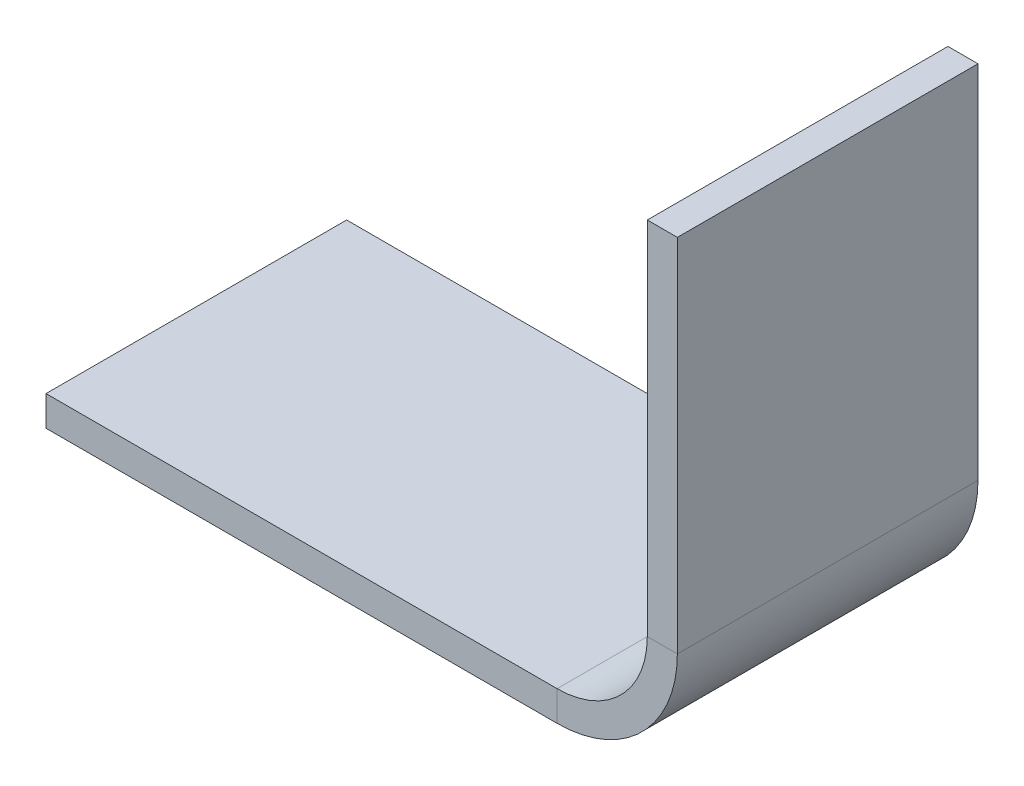
ISO-10303-21;
HEADER;
FILE_DESCRIPTION(('STEP AP214'),'2;1');
FILE_NAME('part.step','',(''),(''),'','','');
FILE_SCHEMA(('AUTOMOTIVE_DESIGN { 1 0 10303 214 1 1 1 1 }'));
ENDSEC;
DATA;
#1=APPLICATION_CONTEXT('core data for automotive mechanical design processes');
#2=APPLICATION_PROTOCOL_DEFINITION('international standard','automotive_design',2000,#1);
#3=PRODUCT_CONTEXT('',#1,'mechanical');
#4=PRODUCT('Part','Part','',(#3));
#5=PRODUCT_RELATED_PRODUCT_CATEGORY('part','',(#4));
#6=PRODUCT_DEFINITION_FORMATION('','',#4);
#7=PRODUCT_DEFINITION_CONTEXT('part definition',#1,'design');
#8=PRODUCT_DEFINITION('design','',#6,#7);
#9=PRODUCT_DEFINITION_SHAPE('','',#8);
#10=(LENGTH_UNIT() NAMED_UNIT(*) SI_UNIT(.MILLI.,.METRE.));
#11=(NAMED_UNIT(*) PLANE_ANGLE_UNIT() SI_UNIT($,.RADIAN.));
#12=(NAMED_UNIT(*) SI_UNIT($,.STERADIAN.) SOLID_ANGLE_UNIT());
#13=UNCERTAINTY_MEASURE_WITH_UNIT(LENGTH_MEASURE(1.E-05),#10,'distance_accuracy_value','');
#14=(GEOMETRIC_REPRESENTATION_CONTEXT(3) GLOBAL_UNCERTAINTY_ASSIGNED_CONTEXT((#13)) GLOBAL_UNIT_ASSIGNED_CONTEXT((#10,
#11,#12)) REPRESENTATION_CONTEXT('',''));
#15=CARTESIAN_POINT('',(0.,0.,0.));
#16=DIRECTION('',(0.,0.,1.));
#17=DIRECTION('',(1.,0.,0.));
#18=AXIS2_PLACEMENT_3D('',#15,#16,#17);
#19=CARTESIAN_POINT('',(20.,3.,10.));
#20=DIRECTION('',(0.,0.,1.));
#21=DIRECTION('',(1.,0.,0.));
#22=AXIS2_PLACEMENT_3D('',#19,#20,#21);
#23=PLANE('',#22);
#24=DIRECTION('',(1.,0.,0.));
#25=VECTOR('',#24,1.);
#26=CARTESIAN_POINT('',(20.,3.,10.));
#27=LINE('',#26,#25);
#28=CARTESIAN_POINT('',(20.,3.,10.));
#29=VERTEX_POINT('',#28);
#30=CARTESIAN_POINT('',(21.,3.,10.));
#31=VERTEX_POINT('',#30);
#32=EDGE_CURVE('E11',#29,#31,#27,.T.);
#33=ORIENTED_EDGE('',*,*,#32,.F.);
#34=CARTESIAN_POINT('',(17.,3.,10.));
#35=DIRECTION('',(0.,0.,-1.));
#36=DIRECTION('',(-1.,0.,0.));
#37=AXIS2_PLACEMENT_3D('',#34,#35,#36);
#38=CIRCLE('',#37,3.);
#39=CARTESIAN_POINT('',(17.,0.,10.));
#40=VERTEX_POINT('',#39);
#41=EDGE_CURVE('E139',#40,#29,#38,.F.);
#42=ORIENTED_EDGE('',*,*,#41,.F.);
#43=DIRECTION('',(0.,1.,0.));
#44=VECTOR('',#43,1.);
#45=CARTESIAN_POINT('',(17.,-1.,10.));
#46=LINE('',#45,#44);
#47=CARTESIAN_POINT('',(17.,-1.,10.));
#48=VERTEX_POINT('',#47);
#49=EDGE_CURVE('E47',#48,#40,#46,.T.);
#50=ORIENTED_EDGE('',*,*,#49,.F.);
#51=CARTESIAN_POINT('',(17.,3.,10.));
#52=DIRECTION('',(0.,0.,1.));
#53=DIRECTION('',(1.,0.,0.));
#54=AXIS2_PLACEMENT_3D('',#51,#52,#53);
#55=CIRCLE('',#54,4.);
#56=EDGE_CURVE('E133',#48,#31,#55,.T.);
#57=ORIENTED_EDGE('',*,*,#56,.T.);
#58=EDGE_LOOP('',(#33,#42,#50,#57));
#59=FACE_BOUND('',#58,.T.);
#60=ADVANCED_FACE('F41',(#59),#23,.T.);
#61=CARTESIAN_POINT('',(17.,-1.,10.));
#62=DIRECTION('',(0.,0.,1.));
#63=DIRECTION('',(1.,0.,0.));
#64=AXIS2_PLACEMENT_3D('',#61,#62,#63);
#65=PLANE('',#64);
#66=DIRECTION('',(0.,1.,0.));
#67=VECTOR('',#66,1.);
#68=CARTESIAN_POINT('',(20.,0.,10.));
#69=LINE('',#68,#67);
#70=CARTESIAN_POINT('',(20.,15.,10.));
#71=VERTEX_POINT('',#70);
#72=EDGE_CURVE('E189',#29,#71,#69,.T.);
#73=ORIENTED_EDGE('',*,*,#72,.F.);
#74=ORIENTED_EDGE('',*,*,#32,.T.);
#75=DIRECTION('',(0.,1.,0.));
#76=VECTOR('',#75,1.);
#77=CARTESIAN_POINT('',(21.,0.,10.));
#78=LINE('',#77,#76);
#79=CARTESIAN_POINT('',(21.,15.,10.));
#80=VERTEX_POINT('',#79);
#81=EDGE_CURVE('E100',#31,#80,#78,.T.);
#82=ORIENTED_EDGE('',*,*,#81,.T.);
#83=DIRECTION('',(1.,0.,0.));
#84=VECTOR('',#83,1.);
#85=CARTESIAN_POINT('',(20.,15.,10.));
#86=LINE('',#85,#84);
#87=EDGE_CURVE('E341',#71,#80,#86,.T.);
#88=ORIENTED_EDGE('',*,*,#87,.F.);
#89=EDGE_LOOP('',(#73,#74,#82,#88));
#90=FACE_BOUND('',#89,.T.);
#91=ADVANCED_FACE('F193',(#90),#65,.T.);
#92=CARTESIAN_POINT('',(17.,0.,0.));
#93=DIRECTION('',(0.,0.,-1.));
#94=DIRECTION('',(-1.,0.,0.));
#95=AXIS2_PLACEMENT_3D('',#92,#93,#94);
#96=PLANE('',#95);
#97=DIRECTION('',(0.,-1.,0.));
#98=VECTOR('',#97,1.);
#99=CARTESIAN_POINT('',(17.,0.,0.));
#100=LINE('',#99,#98);
#101=CARTESIAN_POINT('',(17.,0.,0.));
#102=VERTEX_POINT('',#101);
#103=CARTESIAN_POINT('',(17.,-1.,0.));
#104=VERTEX_POINT('',#103);
#105=EDGE_CURVE('E81',#102,#104,#100,.T.);
#106=ORIENTED_EDGE('',*,*,#105,.F.);
#107=CARTESIAN_POINT('',(17.,3.,0.));
#108=DIRECTION('',(0.,0.,-1.));
#109=DIRECTION('',(-1.,0.,0.));
#110=AXIS2_PLACEMENT_3D('',#107,#108,#109);
#111=CIRCLE('',#110,3.);
#112=CARTESIAN_POINT('',(20.,3.,0.));
#113=VERTEX_POINT('',#112);
#114=EDGE_CURVE('E153',#102,#113,#111,.F.);
#115=ORIENTED_EDGE('',*,*,#114,.T.);
#116=DIRECTION('',(-1.,0.,0.));
#117=VECTOR('',#116,1.);
#118=CARTESIAN_POINT('',(21.,3.,0.));
#119=LINE('',#118,#117);
#120=CARTESIAN_POINT('',(21.,3.,0.));
#121=VERTEX_POINT('',#120);
#122=EDGE_CURVE('E93',#121,#113,#119,.T.);
#123=ORIENTED_EDGE('',*,*,#122,.F.);
#124=CARTESIAN_POINT('',(17.,3.,0.));
#125=DIRECTION('',(0.,0.,1.));
#126=DIRECTION('',(1.,0.,0.));
#127=AXIS2_PLACEMENT_3D('',#124,#125,#126);
#128=CIRCLE('',#127,4.);
#129=EDGE_CURVE('E159',#104,#121,#128,.T.);
#130=ORIENTED_EDGE('',*,*,#129,.F.);
#131=EDGE_LOOP('',(#106,#115,#123,#130));
#132=FACE_BOUND('',#131,.T.);
#133=ADVANCED_FACE('F194',(#132),#96,.T.);
#134=CARTESIAN_POINT('',(21.,3.,0.));
#135=DIRECTION('',(0.,0.,-1.));
#136=DIRECTION('',(-1.,0.,0.));
#137=AXIS2_PLACEMENT_3D('',#134,#135,#136);
#138=PLANE('',#137);
#139=DIRECTION('',(1.,0.,0.));
#140=VECTOR('',#139,1.);
#141=CARTESIAN_POINT('',(0.,0.,0.));
#142=LINE('',#141,#140);
#143=CARTESIAN_POINT('',(0.,0.,0.));
#144=VERTEX_POINT('',#143);
#145=EDGE_CURVE('E154',#144,#102,#142,.T.);
#146=ORIENTED_EDGE('',*,*,#145,.T.);
#147=ORIENTED_EDGE('',*,*,#105,.T.);
#148=DIRECTION('',(1.,0.,0.));
#149=VECTOR('',#148,1.);
#150=CARTESIAN_POINT('',(0.,-1.,0.));
#151=LINE('',#150,#149);
#152=CARTESIAN_POINT('',(0.,-1.,0.));
#153=VERTEX_POINT('',#152);
#154=EDGE_CURVE('E158',#153,#104,#151,.T.);
#155=ORIENTED_EDGE('',*,*,#154,.F.);
#156=DIRECTION('',(0.,1.,0.));
#157=VECTOR('',#156,1.);
#158=CARTESIAN_POINT('',(0.,-1.,0.));
#159=LINE('',#158,#157);
#160=EDGE_CURVE('E120',#153,#144,#159,.T.);
#161=ORIENTED_EDGE('',*,*,#160,.T.);
#162=EDGE_LOOP('',(#146,#147,#155,#161));
#163=FACE_BOUND('',#162,.T.);
#164=ADVANCED_FACE('F190',(#163),#138,.T.);
#165=CARTESIAN_POINT('',(21.,0.,10.));
#166=DIRECTION('',(-1.,0.,0.));
#167=DIRECTION('',(0.,0.,1.));
#168=AXIS2_PLACEMENT_3D('',#165,#166,#167);
#169=PLANE('',#168);
#170=DIRECTION('',(0.,1.,0.));
#171=VECTOR('',#170,1.);
#172=CARTESIAN_POINT('',(21.,0.,0.));
#173=LINE('',#172,#171);
#174=CARTESIAN_POINT('',(21.,15.,0.));
#175=VERTEX_POINT('',#174);
#176=EDGE_CURVE('E145',#121,#175,#173,.T.);
#177=ORIENTED_EDGE('',*,*,#176,.T.);
#178=DIRECTION('',(0.,0.,-1.));
#179=VECTOR('',#178,1.);
#180=CARTESIAN_POINT('',(21.,15.,10.));
#181=LINE('',#180,#179);
#182=EDGE_CURVE('E175',#80,#175,#181,.T.);
#183=ORIENTED_EDGE('',*,*,#182,.F.);
#184=ORIENTED_EDGE('',*,*,#81,.F.);
#185=DIRECTION('',(0.,0.,-1.));
#186=VECTOR('',#185,1.);
#187=CARTESIAN_POINT('',(21.,3.,10.));
#188=LINE('',#187,#186);
#189=EDGE_CURVE('E141',#31,#121,#188,.T.);
#190=ORIENTED_EDGE('',*,*,#189,.T.);
#191=EDGE_LOOP('',(#177,#183,#184,#190));
#192=FACE_BOUND('',#191,.T.);
#193=ADVANCED_FACE('F203',(#192),#169,.F.);
#194=CARTESIAN_POINT('',(20.,15.,10.));
#195=DIRECTION('',(0.,1.,0.));
#196=DIRECTION('',(0.,0.,1.));
#197=AXIS2_PLACEMENT_3D('',#194,#195,#196);
#198=PLANE('',#197);
#199=DIRECTION('',(1.,0.,0.));
#200=VECTOR('',#199,1.);
#201=CARTESIAN_POINT('',(20.,15.,0.));
#202=LINE('',#201,#200);
#203=CARTESIAN_POINT('',(20.,15.,0.));
#204=VERTEX_POINT('',#203);
#205=EDGE_CURVE('E150',#204,#175,#202,.T.);
#206=ORIENTED_EDGE('',*,*,#205,.F.);
#207=DIRECTION('',(0.,0.,-1.));
#208=VECTOR('',#207,1.);
#209=CARTESIAN_POINT('',(20.,15.,10.));
#210=LINE('',#209,#208);
#211=EDGE_CURVE('E174',#71,#204,#210,.T.);
#212=ORIENTED_EDGE('',*,*,#211,.F.);
#213=ORIENTED_EDGE('',*,*,#87,.T.);
#214=ORIENTED_EDGE('',*,*,#182,.T.);
#215=EDGE_LOOP('',(#206,#212,#213,#214));
#216=FACE_BOUND('',#215,.T.);
#217=ADVANCED_FACE('F231',(#216),#198,.T.);
#218=CARTESIAN_POINT('',(20.,0.,10.));
#219=DIRECTION('',(-1.,0.,0.));
#220=DIRECTION('',(0.,0.,1.));
#221=AXIS2_PLACEMENT_3D('',#218,#219,#220);
#222=PLANE('',#221);
#223=DIRECTION('',(0.,1.,0.));
#224=VECTOR('',#223,1.);
#225=CARTESIAN_POINT('',(20.,0.,0.));
#226=LINE('',#225,#224);
#227=EDGE_CURVE('E147',#113,#204,#226,.T.);
#228=ORIENTED_EDGE('',*,*,#227,.F.);
#229=DIRECTION('',(0.,0.,-1.));
#230=VECTOR('',#229,1.);
#231=CARTESIAN_POINT('',(20.,3.,10.));
#232=LINE('',#231,#230);
#233=EDGE_CURVE('E166',#29,#113,#232,.T.);
#234=ORIENTED_EDGE('',*,*,#233,.F.);
#235=ORIENTED_EDGE('',*,*,#72,.T.);
#236=ORIENTED_EDGE('',*,*,#211,.T.);
#237=EDGE_LOOP('',(#228,#234,#235,#236));
#238=FACE_BOUND('',#237,.T.);
#239=ADVANCED_FACE('F241',(#238),#222,.T.);
#240=CARTESIAN_POINT('',(17.,3.,10.));
#241=DIRECTION('',(0.,0.,-1.));
#242=DIRECTION('',(-1.,0.,0.));
#243=AXIS2_PLACEMENT_3D('',#240,#241,#242);
#244=CYLINDRICAL_SURFACE('',#243,3.);
#245=ORIENTED_EDGE('',*,*,#114,.F.);
#246=DIRECTION('',(0.,0.,-1.));
#247=VECTOR('',#246,1.);
#248=CARTESIAN_POINT('',(17.,0.,10.));
#249=LINE('',#248,#247);
#250=EDGE_CURVE('E167',#40,#102,#249,.T.);
#251=ORIENTED_EDGE('',*,*,#250,.F.);
#252=ORIENTED_EDGE('',*,*,#41,.T.);
#253=ORIENTED_EDGE('',*,*,#233,.T.);
#254=EDGE_LOOP('',(#245,#251,#252,#253));
#255=FACE_BOUND('',#254,.T.);
#256=ADVANCED_FACE('F181',(#255),#244,.F.);
#257=CARTESIAN_POINT('',(0.,0.,10.));
#258=DIRECTION('',(0.,1.,0.));
#259=DIRECTION('',(0.,0.,1.));
#260=AXIS2_PLACEMENT_3D('',#257,#258,#259);
#261=PLANE('',#260);
#262=ORIENTED_EDGE('',*,*,#145,.F.);
#263=DIRECTION('',(0.,0.,-1.));
#264=VECTOR('',#263,1.);
#265=CARTESIAN_POINT('',(0.,0.,10.));
#266=LINE('',#265,#264);
#267=CARTESIAN_POINT('',(0.,0.,10.));
#268=VERTEX_POINT('',#267);
#269=EDGE_CURVE('E122',#268,#144,#266,.T.);
#270=ORIENTED_EDGE('',*,*,#269,.F.);
#271=DIRECTION('',(1.,0.,0.));
#272=VECTOR('',#271,1.);
#273=CARTESIAN_POINT('',(0.,0.,10.));
#274=LINE('',#273,#272);
#275=EDGE_CURVE('E137',#268,#40,#274,.T.);
#276=ORIENTED_EDGE('',*,*,#275,.T.);
#277=ORIENTED_EDGE('',*,*,#250,.T.);
#278=EDGE_LOOP('',(#262,#270,#276,#277));
#279=FACE_BOUND('',#278,.T.);
#280=ADVANCED_FACE('F187',(#279),#261,.T.);
#281=CARTESIAN_POINT('',(0.,-1.,10.));
#282=DIRECTION('',(-1.,0.,0.));
#283=DIRECTION('',(0.,0.,1.));
#284=AXIS2_PLACEMENT_3D('',#281,#282,#283);
#285=PLANE('',#284);
#286=ORIENTED_EDGE('',*,*,#160,.F.);
#287=DIRECTION('',(0.,0.,-1.));
#288=VECTOR('',#287,1.);
#289=CARTESIAN_POINT('',(0.,-1.,10.));
#290=LINE('',#289,#288);
#291=CARTESIAN_POINT('',(0.,-1.,10.));
#292=VERTEX_POINT('',#291);
#293=EDGE_CURVE('E114',#292,#153,#290,.T.);
#294=ORIENTED_EDGE('',*,*,#293,.F.);
#295=DIRECTION('',(0.,1.,0.));
#296=VECTOR('',#295,1.);
#297=CARTESIAN_POINT('',(0.,-1.,10.));
#298=LINE('',#297,#296);
#299=EDGE_CURVE('E119',#292,#268,#298,.T.);
#300=ORIENTED_EDGE('',*,*,#299,.T.);
#301=ORIENTED_EDGE('',*,*,#269,.T.);
#302=EDGE_LOOP('',(#286,#294,#300,#301));
#303=FACE_BOUND('',#302,.T.);
#304=ADVANCED_FACE('F113',(#303),#285,.T.);
#305=CARTESIAN_POINT('',(0.,-1.,10.));
#306=DIRECTION('',(0.,1.,0.));
#307=DIRECTION('',(0.,0.,1.));
#308=AXIS2_PLACEMENT_3D('',#305,#306,#307);
#309=PLANE('',#308);
#310=ORIENTED_EDGE('',*,*,#154,.T.);
#311=DIRECTION('',(0.,0.,-1.));
#312=VECTOR('',#311,1.);
#313=CARTESIAN_POINT('',(17.,-1.,10.));
#314=LINE('',#313,#312);
#315=EDGE_CURVE('E125',#48,#104,#314,.T.);
#316=ORIENTED_EDGE('',*,*,#315,.F.);
#317=DIRECTION('',(1.,0.,0.));
#318=VECTOR('',#317,1.);
#319=CARTESIAN_POINT('',(0.,-1.,10.));
#320=LINE('',#319,#318);
#321=EDGE_CURVE('E127',#292,#48,#320,.T.);
#322=ORIENTED_EDGE('',*,*,#321,.F.);
#323=ORIENTED_EDGE('',*,*,#293,.T.);
#324=EDGE_LOOP('',(#310,#316,#322,#323));
#325=FACE_BOUND('',#324,.T.);
#326=ADVANCED_FACE('F130',(#325),#309,.F.);
#327=CARTESIAN_POINT('',(17.,3.,10.));
#328=DIRECTION('',(0.,0.,-1.));
#329=DIRECTION('',(-1.,0.,0.));
#330=AXIS2_PLACEMENT_3D('',#327,#328,#329);
#331=CYLINDRICAL_SURFACE('',#330,4.);
#332=ORIENTED_EDGE('',*,*,#129,.T.);
#333=ORIENTED_EDGE('',*,*,#189,.F.);
#334=ORIENTED_EDGE('',*,*,#56,.F.);
#335=ORIENTED_EDGE('',*,*,#315,.T.);
#336=EDGE_LOOP('',(#332,#333,#334,#335));
#337=FACE_BOUND('',#336,.T.);
#338=ADVANCED_FACE('F192',(#337),#331,.T.);
#339=CARTESIAN_POINT('',(17.,3.,10.));
#340=DIRECTION('',(0.,0.,-1.));
#341=DIRECTION('',(-1.,0.,0.));
#342=AXIS2_PLACEMENT_3D('',#339,#340,#341);
#343=PLANE('',#342);
#344=ORIENTED_EDGE('',*,*,#321,.T.);
#345=ORIENTED_EDGE('',*,*,#49,.T.);
#346=ORIENTED_EDGE('',*,*,#275,.F.);
#347=ORIENTED_EDGE('',*,*,#299,.F.);
#348=EDGE_LOOP('',(#344,#345,#346,#347));
#349=FACE_BOUND('',#348,.T.);
#350=ADVANCED_FACE('F135',(#349),#343,.F.);
#351=CARTESIAN_POINT('',(17.,3.,0.));
#352=DIRECTION('',(0.,0.,-1.));
#353=DIRECTION('',(-1.,0.,0.));
#354=AXIS2_PLACEMENT_3D('',#351,#352,#353);
#355=PLANE('',#354);
#356=ORIENTED_EDGE('',*,*,#176,.F.);
#357=ORIENTED_EDGE('',*,*,#122,.T.);
#358=ORIENTED_EDGE('',*,*,#227,.T.);
#359=ORIENTED_EDGE('',*,*,#205,.T.);
#360=EDGE_LOOP('',(#356,#357,#358,#359));
#361=FACE_BOUND('',#360,.T.);
#362=ADVANCED_FACE('F313',(#361),#355,.T.);
#363=CLOSED_SHELL('',(#60,#91,#133,#164,#193,#217,#239,#256,#280,#304,#326,#338,#350,#362));
#364=MANIFOLD_SOLID_BREP('B2',#363);
#365=ADVANCED_BREP_SHAPE_REPRESENTATION('',(#18,#364),#14);
#366=SHAPE_DEFINITION_REPRESENTATION(#9,#365);
ENDSEC;
END-ISO-10303-21;
